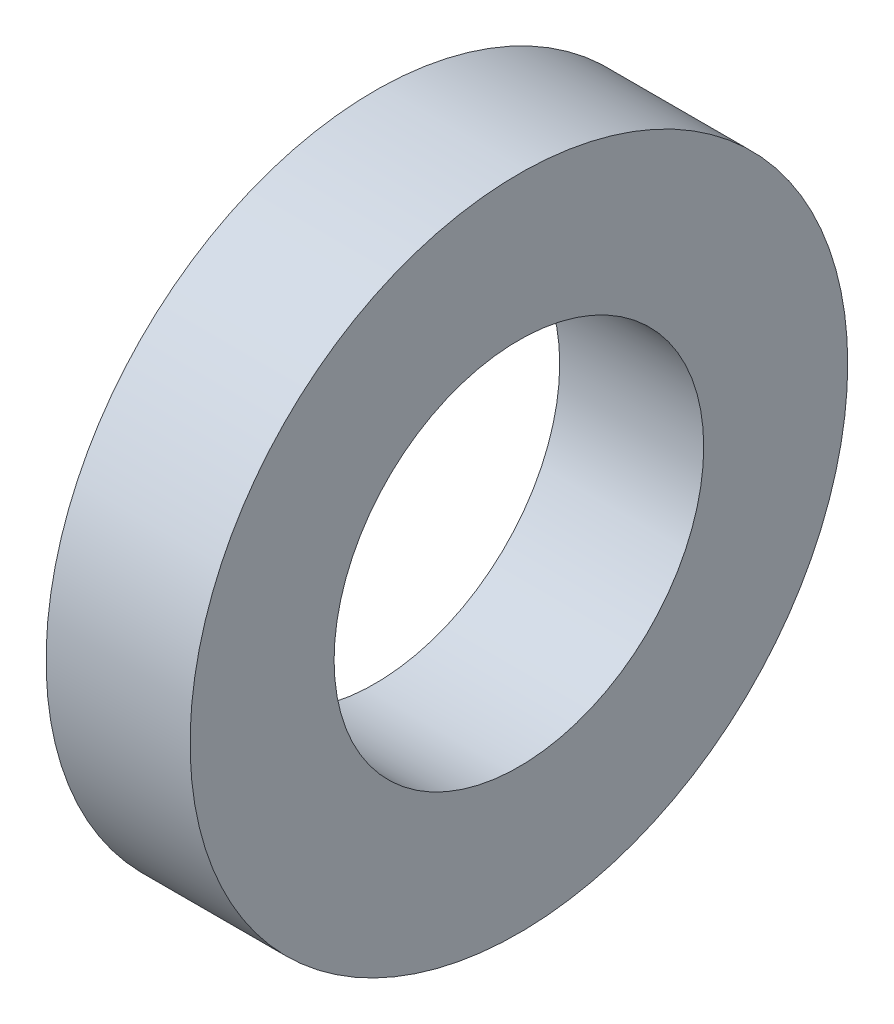
ISO-10303-21;
HEADER;
FILE_DESCRIPTION(('STEP AP214'),'2;1');
FILE_NAME('part.step','',(''),(''),'','','');
FILE_SCHEMA(('AUTOMOTIVE_DESIGN { 1 0 10303 214 1 1 1 1 }'));
ENDSEC;
DATA;
#1=APPLICATION_CONTEXT('core data for automotive mechanical design processes');
#2=APPLICATION_PROTOCOL_DEFINITION('international standard','automotive_design',2000,#1);
#3=PRODUCT_CONTEXT('',#1,'mechanical');
#4=PRODUCT('Part','Part','',(#3));
#5=PRODUCT_RELATED_PRODUCT_CATEGORY('part','',(#4));
#6=PRODUCT_DEFINITION_FORMATION('','',#4);
#7=PRODUCT_DEFINITION_CONTEXT('part definition',#1,'design');
#8=PRODUCT_DEFINITION('design','',#6,#7);
#9=PRODUCT_DEFINITION_SHAPE('','',#8);
#10=(LENGTH_UNIT() NAMED_UNIT(*) SI_UNIT(.MILLI.,.METRE.));
#11=(NAMED_UNIT(*) PLANE_ANGLE_UNIT() SI_UNIT($,.RADIAN.));
#12=(NAMED_UNIT(*) SI_UNIT($,.STERADIAN.) SOLID_ANGLE_UNIT());
#13=UNCERTAINTY_MEASURE_WITH_UNIT(LENGTH_MEASURE(1.E-05),#10,'distance_accuracy_value','');
#14=(GEOMETRIC_REPRESENTATION_CONTEXT(3) GLOBAL_UNCERTAINTY_ASSIGNED_CONTEXT((#13)) GLOBAL_UNIT_ASSIGNED_CONTEXT((#10,
#11,#12)) REPRESENTATION_CONTEXT('',''));
#15=CARTESIAN_POINT('',(0.,0.,0.));
#16=DIRECTION('',(0.,0.,1.));
#17=DIRECTION('',(1.,0.,0.));
#18=AXIS2_PLACEMENT_3D('',#15,#16,#17);
#19=CARTESIAN_POINT('',(6.35,0.,0.));
#20=DIRECTION('',(1.,0.,0.));
#21=DIRECTION('',(0.,0.,-1.));
#22=AXIS2_PLACEMENT_3D('',#19,#20,#21);
#23=PLANE('',#22);
#24=CARTESIAN_POINT('',(6.35,0.,0.));
#25=DIRECTION('',(1.,0.,0.));
#26=DIRECTION('',(0.,0.,-1.));
#27=AXIS2_PLACEMENT_3D('',#24,#25,#26);
#28=CIRCLE('',#27,14.5);
#29=CARTESIAN_POINT('',(6.35,0.,-14.5));
#30=VERTEX_POINT('',#29);
#31=EDGE_CURVE('E10',#30,#30,#28,.T.);
#32=ORIENTED_EDGE('',*,*,#31,.T.);
#33=EDGE_LOOP('',(#32));
#34=FACE_BOUND('',#33,.T.);
#35=CARTESIAN_POINT('',(6.35,0.,0.));
#36=DIRECTION('',(1.,0.,0.));
#37=DIRECTION('',(0.,0.,-1.));
#38=AXIS2_PLACEMENT_3D('',#35,#36,#37);
#39=CIRCLE('',#38,8.15);
#40=CARTESIAN_POINT('',(6.35,0.,-8.15));
#41=VERTEX_POINT('',#40);
#42=EDGE_CURVE('E52',#41,#41,#39,.T.);
#43=ORIENTED_EDGE('',*,*,#42,.F.);
#44=EDGE_LOOP('',(#43));
#45=FACE_BOUND('',#44,.T.);
#46=ADVANCED_FACE('F39',(#34,#45),#23,.T.);
#47=CARTESIAN_POINT('',(0.,0.,0.));
#48=DIRECTION('',(1.,0.,0.));
#49=DIRECTION('',(0.,0.,-1.));
#50=AXIS2_PLACEMENT_3D('',#47,#48,#49);
#51=PLANE('',#50);
#52=CARTESIAN_POINT('',(0.,0.,0.));
#53=DIRECTION('',(1.,0.,0.));
#54=DIRECTION('',(0.,0.,-1.));
#55=AXIS2_PLACEMENT_3D('',#52,#53,#54);
#56=CIRCLE('',#55,14.5);
#57=CARTESIAN_POINT('',(0.,0.,-14.5));
#58=VERTEX_POINT('',#57);
#59=EDGE_CURVE('E43',#58,#58,#56,.T.);
#60=ORIENTED_EDGE('',*,*,#59,.F.);
#61=EDGE_LOOP('',(#60));
#62=FACE_BOUND('',#61,.T.);
#63=CARTESIAN_POINT('',(0.,0.,0.));
#64=DIRECTION('',(1.,0.,0.));
#65=DIRECTION('',(0.,0.,-1.));
#66=AXIS2_PLACEMENT_3D('',#63,#64,#65);
#67=CIRCLE('',#66,8.15);
#68=CARTESIAN_POINT('',(0.,0.,-8.15));
#69=VERTEX_POINT('',#68);
#70=EDGE_CURVE('E54',#69,#69,#67,.T.);
#71=ORIENTED_EDGE('',*,*,#70,.T.);
#72=EDGE_LOOP('',(#71));
#73=FACE_BOUND('',#72,.T.);
#74=ADVANCED_FACE('F66',(#62,#73),#51,.F.);
#75=CARTESIAN_POINT('',(6.35,0.,0.));
#76=DIRECTION('',(-1.,0.,0.));
#77=DIRECTION('',(0.,0.,1.));
#78=AXIS2_PLACEMENT_3D('',#75,#76,#77);
#79=CYLINDRICAL_SURFACE('',#78,14.5);
#80=ORIENTED_EDGE('',*,*,#31,.F.);
#81=EDGE_LOOP('',(#80));
#82=FACE_BOUND('',#81,.T.);
#83=ORIENTED_EDGE('',*,*,#59,.T.);
#84=EDGE_LOOP('',(#83));
#85=FACE_BOUND('',#84,.T.);
#86=ADVANCED_FACE('F41',(#82,#85),#79,.T.);
#87=CARTESIAN_POINT('',(6.35,0.,0.));
#88=DIRECTION('',(-1.,0.,0.));
#89=DIRECTION('',(0.,0.,1.));
#90=AXIS2_PLACEMENT_3D('',#87,#88,#89);
#91=CYLINDRICAL_SURFACE('',#90,8.15);
#92=ORIENTED_EDGE('',*,*,#42,.T.);
#93=EDGE_LOOP('',(#92));
#94=FACE_BOUND('',#93,.T.);
#95=ORIENTED_EDGE('',*,*,#70,.F.);
#96=EDGE_LOOP('',(#95));
#97=FACE_BOUND('',#96,.T.);
#98=ADVANCED_FACE('F62',(#94,#97),#91,.F.);
#99=CLOSED_SHELL('',(#46,#74,#86,#98));
#100=MANIFOLD_SOLID_BREP('B2',#99);
#101=ADVANCED_BREP_SHAPE_REPRESENTATION('',(#18,#100),#14);
#102=SHAPE_DEFINITION_REPRESENTATION(#9,#101);
ENDSEC;
END-ISO-10303-21;
